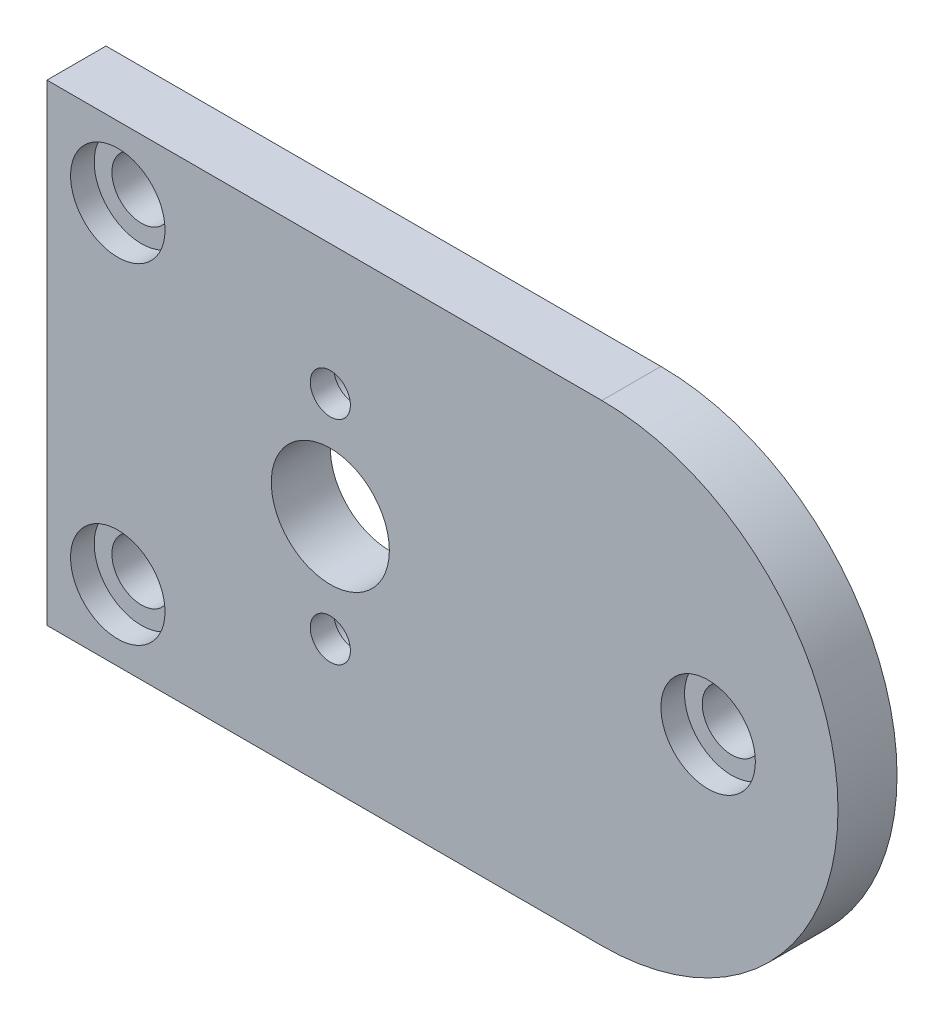
ISO-10303-21;
HEADER;
FILE_DESCRIPTION(('STEP AP214'),'2;1');
FILE_NAME('part.step','',(''),(''),'','','');
FILE_SCHEMA(('AUTOMOTIVE_DESIGN { 1 0 10303 214 1 1 1 1 }'));
ENDSEC;
DATA;
#1=APPLICATION_CONTEXT('core data for automotive mechanical design processes');
#2=APPLICATION_PROTOCOL_DEFINITION('international standard','automotive_design',2000,#1);
#3=PRODUCT_CONTEXT('',#1,'mechanical');
#4=PRODUCT('Part','Part','',(#3));
#5=PRODUCT_RELATED_PRODUCT_CATEGORY('part','',(#4));
#6=PRODUCT_DEFINITION_FORMATION('','',#4);
#7=PRODUCT_DEFINITION_CONTEXT('part definition',#1,'design');
#8=PRODUCT_DEFINITION('design','',#6,#7);
#9=PRODUCT_DEFINITION_SHAPE('','',#8);
#10=(LENGTH_UNIT() NAMED_UNIT(*) SI_UNIT(.MILLI.,.METRE.));
#11=(NAMED_UNIT(*) PLANE_ANGLE_UNIT() SI_UNIT($,.RADIAN.));
#12=(NAMED_UNIT(*) SI_UNIT($,.STERADIAN.) SOLID_ANGLE_UNIT());
#13=UNCERTAINTY_MEASURE_WITH_UNIT(LENGTH_MEASURE(1.E-05),#10,'distance_accuracy_value','');
#14=(GEOMETRIC_REPRESENTATION_CONTEXT(3) GLOBAL_UNCERTAINTY_ASSIGNED_CONTEXT((#13)) GLOBAL_UNIT_ASSIGNED_CONTEXT((#10,
#11,#12)) REPRESENTATION_CONTEXT('',''));
#15=CARTESIAN_POINT('',(0.,0.,0.));
#16=DIRECTION('',(0.,0.,1.));
#17=DIRECTION('',(1.,0.,0.));
#18=AXIS2_PLACEMENT_3D('',#15,#16,#17);
#19=CARTESIAN_POINT('',(0.,4.5,21.25));
#20=DIRECTION('',(0.,0.,1.));
#21=DIRECTION('',(-1.,0.,0.));
#22=AXIS2_PLACEMENT_3D('',#19,#20,#21);
#23=CYLINDRICAL_SURFACE('',#22,0.85);
#24=CARTESIAN_POINT('',(0.,4.5,23.75));
#25=DIRECTION('',(0.,0.,1.));
#26=DIRECTION('',(1.,0.,0.));
#27=AXIS2_PLACEMENT_3D('',#24,#25,#26);
#28=CIRCLE('',#27,0.85);
#29=CARTESIAN_POINT('',(0.849999999999998,4.5,23.75));
#30=VERTEX_POINT('',#29);
#31=EDGE_CURVE('E167',#30,#30,#28,.T.);
#32=ORIENTED_EDGE('',*,*,#31,.T.);
#33=EDGE_LOOP('',(#32));
#34=FACE_BOUND('',#33,.T.);
#35=CARTESIAN_POINT('',(0.,4.5,22.75));
#36=DIRECTION('',(0.,0.,1.));
#37=DIRECTION('',(1.,0.,0.));
#38=AXIS2_PLACEMENT_3D('',#35,#36,#37);
#39=CIRCLE('',#38,0.85);
#40=CARTESIAN_POINT('',(0.849999999999998,4.5,22.75));
#41=VERTEX_POINT('',#40);
#42=EDGE_CURVE('E198',#41,#41,#39,.T.);
#43=ORIENTED_EDGE('',*,*,#42,.F.);
#44=EDGE_LOOP('',(#43));
#45=FACE_BOUND('',#44,.T.);
#46=ADVANCED_FACE('F117',(#34,#45),#23,.F.);
#47=CARTESIAN_POINT('',(0.,-4.5,21.25));
#48=DIRECTION('',(0.,0.,1.));
#49=DIRECTION('',(-1.,0.,0.));
#50=AXIS2_PLACEMENT_3D('',#47,#48,#49);
#51=CYLINDRICAL_SURFACE('',#50,0.85);
#52=CARTESIAN_POINT('',(0.,-4.5,23.75));
#53=DIRECTION('',(0.,0.,1.));
#54=DIRECTION('',(1.,0.,0.));
#55=AXIS2_PLACEMENT_3D('',#52,#53,#54);
#56=CIRCLE('',#55,0.85);
#57=CARTESIAN_POINT('',(0.850000000000001,-4.5,23.75));
#58=VERTEX_POINT('',#57);
#59=EDGE_CURVE('E205',#58,#58,#56,.T.);
#60=ORIENTED_EDGE('',*,*,#59,.T.);
#61=EDGE_LOOP('',(#60));
#62=FACE_BOUND('',#61,.T.);
#63=CARTESIAN_POINT('',(0.,-4.5,22.75));
#64=DIRECTION('',(0.,0.,1.));
#65=DIRECTION('',(1.,0.,0.));
#66=AXIS2_PLACEMENT_3D('',#63,#64,#65);
#67=CIRCLE('',#66,0.85);
#68=CARTESIAN_POINT('',(0.850000000000001,-4.5,22.75));
#69=VERTEX_POINT('',#68);
#70=EDGE_CURVE('E212',#69,#69,#67,.T.);
#71=ORIENTED_EDGE('',*,*,#70,.F.);
#72=EDGE_LOOP('',(#71));
#73=FACE_BOUND('',#72,.T.);
#74=ADVANCED_FACE('F259',(#62,#73),#51,.F.);
#75=CARTESIAN_POINT('',(0.,10.0000000000001,21.25));
#76=DIRECTION('',(0.,-1.,0.));
#77=DIRECTION('',(1.,0.,0.));
#78=AXIS2_PLACEMENT_3D('',#75,#76,#77);
#79=PLANE('',#78);
#80=DIRECTION('',(-1.,0.,0.));
#81=VECTOR('',#80,1.);
#82=CARTESIAN_POINT('',(0.,10.0000000000001,23.75));
#83=LINE('',#82,#81);
#84=CARTESIAN_POINT('',(11.5,10.,23.75));
#85=VERTEX_POINT('',#84);
#86=CARTESIAN_POINT('',(-12.,10.,23.75));
#87=VERTEX_POINT('',#86);
#88=EDGE_CURVE('E164',#85,#87,#83,.T.);
#89=ORIENTED_EDGE('',*,*,#88,.F.);
#90=DIRECTION('',(0.,0.,1.));
#91=VECTOR('',#90,1.);
#92=CARTESIAN_POINT('',(11.5,10.,21.25));
#93=LINE('',#92,#91);
#94=CARTESIAN_POINT('',(11.5,10.,21.25));
#95=VERTEX_POINT('',#94);
#96=EDGE_CURVE('E170',#95,#85,#93,.T.);
#97=ORIENTED_EDGE('',*,*,#96,.F.);
#98=DIRECTION('',(-1.,0.,0.));
#99=VECTOR('',#98,1.);
#100=CARTESIAN_POINT('',(0.,10.0000000000001,21.25));
#101=LINE('',#100,#99);
#102=CARTESIAN_POINT('',(-12.,10.,21.25));
#103=VERTEX_POINT('',#102);
#104=EDGE_CURVE('E188',#95,#103,#101,.T.);
#105=ORIENTED_EDGE('',*,*,#104,.T.);
#106=DIRECTION('',(0.,0.,1.));
#107=VECTOR('',#106,1.);
#108=CARTESIAN_POINT('',(-12.,10.,21.25));
#109=LINE('',#108,#107);
#110=EDGE_CURVE('E13',#103,#87,#109,.T.);
#111=ORIENTED_EDGE('',*,*,#110,.T.);
#112=EDGE_LOOP('',(#89,#97,#105,#111));
#113=FACE_BOUND('',#112,.T.);
#114=ADVANCED_FACE('F178',(#113),#79,.F.);
#115=CARTESIAN_POINT('',(-12.,0.,21.25));
#116=DIRECTION('',(1.,0.,0.));
#117=DIRECTION('',(0.,1.,0.));
#118=AXIS2_PLACEMENT_3D('',#115,#116,#117);
#119=PLANE('',#118);
#120=DIRECTION('',(0.,-1.,0.));
#121=VECTOR('',#120,1.);
#122=CARTESIAN_POINT('',(-12.,0.,23.75));
#123=LINE('',#122,#121);
#124=CARTESIAN_POINT('',(-12.,-10.,23.75));
#125=VERTEX_POINT('',#124);
#126=EDGE_CURVE('E180',#87,#125,#123,.T.);
#127=ORIENTED_EDGE('',*,*,#126,.F.);
#128=ORIENTED_EDGE('',*,*,#110,.F.);
#129=DIRECTION('',(0.,-1.,0.));
#130=VECTOR('',#129,1.);
#131=CARTESIAN_POINT('',(-12.,0.,21.25));
#132=LINE('',#131,#130);
#133=CARTESIAN_POINT('',(-12.,-10.,21.25));
#134=VERTEX_POINT('',#133);
#135=EDGE_CURVE('E240',#103,#134,#132,.T.);
#136=ORIENTED_EDGE('',*,*,#135,.T.);
#137=DIRECTION('',(0.,0.,1.));
#138=VECTOR('',#137,1.);
#139=CARTESIAN_POINT('',(-12.,-10.,21.25));
#140=LINE('',#139,#138);
#141=EDGE_CURVE('E126',#134,#125,#140,.T.);
#142=ORIENTED_EDGE('',*,*,#141,.T.);
#143=EDGE_LOOP('',(#127,#128,#136,#142));
#144=FACE_BOUND('',#143,.T.);
#145=ADVANCED_FACE('F243',(#144),#119,.F.);
#146=CARTESIAN_POINT('',(0.,-10.,21.25));
#147=DIRECTION('',(0.,-1.,0.));
#148=DIRECTION('',(0.,0.,1.));
#149=AXIS2_PLACEMENT_3D('',#146,#147,#148);
#150=PLANE('',#149);
#151=DIRECTION('',(-1.,0.,0.));
#152=VECTOR('',#151,1.);
#153=CARTESIAN_POINT('',(0.,-10.,23.75));
#154=LINE('',#153,#152);
#155=CARTESIAN_POINT('',(11.5,-10.,23.75));
#156=VERTEX_POINT('',#155);
#157=EDGE_CURVE('E165',#156,#125,#154,.T.);
#158=ORIENTED_EDGE('',*,*,#157,.T.);
#159=ORIENTED_EDGE('',*,*,#141,.F.);
#160=DIRECTION('',(-1.,0.,0.));
#161=VECTOR('',#160,1.);
#162=CARTESIAN_POINT('',(0.,-10.,21.25));
#163=LINE('',#162,#161);
#164=CARTESIAN_POINT('',(11.5,-10.,21.25));
#165=VERTEX_POINT('',#164);
#166=EDGE_CURVE('E135',#165,#134,#163,.T.);
#167=ORIENTED_EDGE('',*,*,#166,.F.);
#168=DIRECTION('',(0.,0.,1.));
#169=VECTOR('',#168,1.);
#170=CARTESIAN_POINT('',(11.5,-10.,21.25));
#171=LINE('',#170,#169);
#172=EDGE_CURVE('E175',#165,#156,#171,.T.);
#173=ORIENTED_EDGE('',*,*,#172,.T.);
#174=EDGE_LOOP('',(#158,#159,#167,#173));
#175=FACE_BOUND('',#174,.T.);
#176=ADVANCED_FACE('F247',(#175),#150,.T.);
#177=CARTESIAN_POINT('',(0.,0.,21.25));
#178=DIRECTION('',(0.,0.,-1.));
#179=DIRECTION('',(1.,0.,0.));
#180=AXIS2_PLACEMENT_3D('',#177,#178,#179);
#181=PLANE('',#180);
#182=CARTESIAN_POINT('',(0.,4.5,21.25));
#183=DIRECTION('',(0.,0.,1.));
#184=DIRECTION('',(1.,0.,0.));
#185=AXIS2_PLACEMENT_3D('',#182,#183,#184);
#186=CIRCLE('',#185,1.1);
#187=CARTESIAN_POINT('',(1.1,4.5,21.25));
#188=VERTEX_POINT('',#187);
#189=EDGE_CURVE('E235',#188,#188,#186,.T.);
#190=ORIENTED_EDGE('',*,*,#189,.T.);
#191=EDGE_LOOP('',(#190));
#192=FACE_BOUND('',#191,.T.);
#193=CARTESIAN_POINT('',(0.,-4.5,21.25));
#194=DIRECTION('',(0.,0.,1.));
#195=DIRECTION('',(1.,0.,0.));
#196=AXIS2_PLACEMENT_3D('',#193,#194,#195);
#197=CIRCLE('',#196,1.1);
#198=CARTESIAN_POINT('',(1.1,-4.5,21.25));
#199=VERTEX_POINT('',#198);
#200=EDGE_CURVE('E230',#199,#199,#197,.T.);
#201=ORIENTED_EDGE('',*,*,#200,.T.);
#202=EDGE_LOOP('',(#201));
#203=FACE_BOUND('',#202,.T.);
#204=ORIENTED_EDGE('',*,*,#104,.F.);
#205=CARTESIAN_POINT('',(11.5,0.,21.25));
#206=DIRECTION('',(0.,0.,1.));
#207=DIRECTION('',(1.,0.,0.));
#208=AXIS2_PLACEMENT_3D('',#205,#206,#207);
#209=CIRCLE('',#208,10.);
#210=EDGE_CURVE('E166',#165,#95,#209,.T.);
#211=ORIENTED_EDGE('',*,*,#210,.F.);
#212=ORIENTED_EDGE('',*,*,#166,.T.);
#213=ORIENTED_EDGE('',*,*,#135,.F.);
#214=EDGE_LOOP('',(#204,#211,#212,#213));
#215=FACE_BOUND('',#214,.T.);
#216=CARTESIAN_POINT('',(-9.00000000000001,7.,21.25));
#217=DIRECTION('',(0.,0.,1.));
#218=DIRECTION('',(1.,0.,0.));
#219=AXIS2_PLACEMENT_3D('',#216,#217,#218);
#220=CIRCLE('',#219,1.25);
#221=CARTESIAN_POINT('',(-7.75000000000001,7.,21.25));
#222=VERTEX_POINT('',#221);
#223=EDGE_CURVE('E197',#222,#222,#220,.T.);
#224=ORIENTED_EDGE('',*,*,#223,.T.);
#225=EDGE_LOOP('',(#224));
#226=FACE_BOUND('',#225,.T.);
#227=CARTESIAN_POINT('',(0.,0.,21.25));
#228=DIRECTION('',(0.,0.,1.));
#229=DIRECTION('',(1.,0.,0.));
#230=AXIS2_PLACEMENT_3D('',#227,#228,#229);
#231=CIRCLE('',#230,2.5);
#232=CARTESIAN_POINT('',(2.5,0.,21.25));
#233=VERTEX_POINT('',#232);
#234=EDGE_CURVE('E202',#233,#233,#231,.T.);
#235=ORIENTED_EDGE('',*,*,#234,.T.);
#236=EDGE_LOOP('',(#235));
#237=FACE_BOUND('',#236,.T.);
#238=CARTESIAN_POINT('',(-9.00000000000001,-7.,21.25));
#239=DIRECTION('',(0.,0.,1.));
#240=DIRECTION('',(1.,0.,0.));
#241=AXIS2_PLACEMENT_3D('',#238,#239,#240);
#242=CIRCLE('',#241,1.25);
#243=CARTESIAN_POINT('',(-7.75,-7.,21.25));
#244=VERTEX_POINT('',#243);
#245=EDGE_CURVE('E194',#244,#244,#242,.T.);
#246=ORIENTED_EDGE('',*,*,#245,.T.);
#247=EDGE_LOOP('',(#246));
#248=FACE_BOUND('',#247,.T.);
#249=CARTESIAN_POINT('',(16.,0.,21.25));
#250=DIRECTION('',(0.,0.,1.));
#251=DIRECTION('',(1.,0.,0.));
#252=AXIS2_PLACEMENT_3D('',#249,#250,#251);
#253=CIRCLE('',#252,1.25);
#254=CARTESIAN_POINT('',(17.25,0.,21.25));
#255=VERTEX_POINT('',#254);
#256=EDGE_CURVE('E176',#255,#255,#253,.T.);
#257=ORIENTED_EDGE('',*,*,#256,.T.);
#258=EDGE_LOOP('',(#257));
#259=FACE_BOUND('',#258,.T.);
#260=ADVANCED_FACE('F244',(#192,#203,#215,#226,#237,#248,#259),#181,.T.);
#261=CARTESIAN_POINT('',(0.,0.,23.75));
#262=DIRECTION('',(0.,0.,-1.));
#263=DIRECTION('',(1.,0.,0.));
#264=AXIS2_PLACEMENT_3D('',#261,#262,#263);
#265=PLANE('',#264);
#266=CARTESIAN_POINT('',(16.,0.,23.75));
#267=DIRECTION('',(0.,0.,1.));
#268=DIRECTION('',(1.,0.,0.));
#269=AXIS2_PLACEMENT_3D('',#266,#267,#268);
#270=CIRCLE('',#269,2.);
#271=CARTESIAN_POINT('',(18.,0.,23.75));
#272=VERTEX_POINT('',#271);
#273=EDGE_CURVE('E291',#272,#272,#270,.T.);
#274=ORIENTED_EDGE('',*,*,#273,.F.);
#275=EDGE_LOOP('',(#274));
#276=FACE_BOUND('',#275,.T.);
#277=CARTESIAN_POINT('',(-9.00000000000001,-7.,23.75));
#278=DIRECTION('',(0.,0.,1.));
#279=DIRECTION('',(1.,0.,0.));
#280=AXIS2_PLACEMENT_3D('',#277,#278,#279);
#281=CIRCLE('',#280,2.);
#282=CARTESIAN_POINT('',(-7.00000000000001,-7.,23.75));
#283=VERTEX_POINT('',#282);
#284=EDGE_CURVE('E288',#283,#283,#281,.T.);
#285=ORIENTED_EDGE('',*,*,#284,.F.);
#286=EDGE_LOOP('',(#285));
#287=FACE_BOUND('',#286,.T.);
#288=CARTESIAN_POINT('',(-9.00000000000001,7.,23.75));
#289=DIRECTION('',(0.,0.,1.));
#290=DIRECTION('',(1.,0.,0.));
#291=AXIS2_PLACEMENT_3D('',#288,#289,#290);
#292=CIRCLE('',#291,2.);
#293=CARTESIAN_POINT('',(-7.,7.,23.75));
#294=VERTEX_POINT('',#293);
#295=EDGE_CURVE('E281',#294,#294,#292,.T.);
#296=ORIENTED_EDGE('',*,*,#295,.F.);
#297=EDGE_LOOP('',(#296));
#298=FACE_BOUND('',#297,.T.);
#299=ORIENTED_EDGE('',*,*,#88,.T.);
#300=ORIENTED_EDGE('',*,*,#126,.T.);
#301=ORIENTED_EDGE('',*,*,#157,.F.);
#302=CARTESIAN_POINT('',(11.5,0.,23.75));
#303=DIRECTION('',(0.,0.,1.));
#304=DIRECTION('',(1.,0.,0.));
#305=AXIS2_PLACEMENT_3D('',#302,#303,#304);
#306=CIRCLE('',#305,10.);
#307=EDGE_CURVE('E155',#156,#85,#306,.T.);
#308=ORIENTED_EDGE('',*,*,#307,.T.);
#309=EDGE_LOOP('',(#299,#300,#301,#308));
#310=FACE_BOUND('',#309,.T.);
#311=ORIENTED_EDGE('',*,*,#31,.F.);
#312=EDGE_LOOP('',(#311));
#313=FACE_BOUND('',#312,.T.);
#314=ORIENTED_EDGE('',*,*,#59,.F.);
#315=EDGE_LOOP('',(#314));
#316=FACE_BOUND('',#315,.T.);
#317=CARTESIAN_POINT('',(0.,0.,23.75));
#318=DIRECTION('',(0.,0.,1.));
#319=DIRECTION('',(1.,0.,0.));
#320=AXIS2_PLACEMENT_3D('',#317,#318,#319);
#321=CIRCLE('',#320,2.5);
#322=CARTESIAN_POINT('',(2.5,0.,23.75));
#323=VERTEX_POINT('',#322);
#324=EDGE_CURVE('E201',#323,#323,#321,.T.);
#325=ORIENTED_EDGE('',*,*,#324,.F.);
#326=EDGE_LOOP('',(#325));
#327=FACE_BOUND('',#326,.T.);
#328=ADVANCED_FACE('F160',(#276,#287,#298,#310,#313,#316,#327),#265,.F.);
#329=CARTESIAN_POINT('',(16.,0.,21.25));
#330=DIRECTION('',(0.,0.,1.));
#331=DIRECTION('',(-1.,0.,0.));
#332=AXIS2_PLACEMENT_3D('',#329,#330,#331);
#333=CYLINDRICAL_SURFACE('',#332,1.25);
#334=CARTESIAN_POINT('',(16.,0.,22.75));
#335=DIRECTION('',(0.,0.,1.));
#336=DIRECTION('',(1.,0.,0.));
#337=AXIS2_PLACEMENT_3D('',#334,#335,#336);
#338=CIRCLE('',#337,1.25);
#339=CARTESIAN_POINT('',(17.25,0.,22.75));
#340=VERTEX_POINT('',#339);
#341=EDGE_CURVE('E120',#340,#340,#338,.T.);
#342=ORIENTED_EDGE('',*,*,#341,.T.);
#343=EDGE_LOOP('',(#342));
#344=FACE_BOUND('',#343,.T.);
#345=ORIENTED_EDGE('',*,*,#256,.F.);
#346=EDGE_LOOP('',(#345));
#347=FACE_BOUND('',#346,.T.);
#348=ADVANCED_FACE('F304',(#344,#347),#333,.F.);
#349=CARTESIAN_POINT('',(-9.00000000000001,-7.,21.25));
#350=DIRECTION('',(0.,0.,1.));
#351=DIRECTION('',(-1.,0.,0.));
#352=AXIS2_PLACEMENT_3D('',#349,#350,#351);
#353=CYLINDRICAL_SURFACE('',#352,1.25);
#354=CARTESIAN_POINT('',(-9.00000000000001,-7.,22.75));
#355=DIRECTION('',(0.,0.,1.));
#356=DIRECTION('',(1.,0.,0.));
#357=AXIS2_PLACEMENT_3D('',#354,#355,#356);
#358=CIRCLE('',#357,1.25);
#359=CARTESIAN_POINT('',(-7.75,-7.,22.75));
#360=VERTEX_POINT('',#359);
#361=EDGE_CURVE('E220',#360,#360,#358,.T.);
#362=ORIENTED_EDGE('',*,*,#361,.T.);
#363=EDGE_LOOP('',(#362));
#364=FACE_BOUND('',#363,.T.);
#365=ORIENTED_EDGE('',*,*,#245,.F.);
#366=EDGE_LOOP('',(#365));
#367=FACE_BOUND('',#366,.T.);
#368=ADVANCED_FACE('F449',(#364,#367),#353,.F.);
#369=CARTESIAN_POINT('',(0.,0.,21.25));
#370=DIRECTION('',(0.,0.,1.));
#371=DIRECTION('',(-1.,0.,0.));
#372=AXIS2_PLACEMENT_3D('',#369,#370,#371);
#373=CYLINDRICAL_SURFACE('',#372,2.5);
#374=ORIENTED_EDGE('',*,*,#234,.F.);
#375=EDGE_LOOP('',(#374));
#376=FACE_BOUND('',#375,.T.);
#377=ORIENTED_EDGE('',*,*,#324,.T.);
#378=EDGE_LOOP('',(#377));
#379=FACE_BOUND('',#378,.T.);
#380=ADVANCED_FACE('F440',(#376,#379),#373,.F.);
#381=CARTESIAN_POINT('',(-9.00000000000001,7.,21.25));
#382=DIRECTION('',(0.,0.,1.));
#383=DIRECTION('',(-1.,0.,0.));
#384=AXIS2_PLACEMENT_3D('',#381,#382,#383);
#385=CYLINDRICAL_SURFACE('',#384,1.25);
#386=CARTESIAN_POINT('',(-9.00000000000001,7.,22.75));
#387=DIRECTION('',(0.,0.,1.));
#388=DIRECTION('',(1.,0.,0.));
#389=AXIS2_PLACEMENT_3D('',#386,#387,#388);
#390=CIRCLE('',#389,1.25);
#391=CARTESIAN_POINT('',(-7.75000000000001,7.,22.75));
#392=VERTEX_POINT('',#391);
#393=EDGE_CURVE('E218',#392,#392,#390,.T.);
#394=ORIENTED_EDGE('',*,*,#393,.T.);
#395=EDGE_LOOP('',(#394));
#396=FACE_BOUND('',#395,.T.);
#397=ORIENTED_EDGE('',*,*,#223,.F.);
#398=EDGE_LOOP('',(#397));
#399=FACE_BOUND('',#398,.T.);
#400=ADVANCED_FACE('F430',(#396,#399),#385,.F.);
#401=CARTESIAN_POINT('',(11.5,0.,21.25));
#402=DIRECTION('',(0.,0.,1.));
#403=DIRECTION('',(-1.,0.,0.));
#404=AXIS2_PLACEMENT_3D('',#401,#402,#403);
#405=CYLINDRICAL_SURFACE('',#404,10.);
#406=ORIENTED_EDGE('',*,*,#307,.F.);
#407=ORIENTED_EDGE('',*,*,#172,.F.);
#408=ORIENTED_EDGE('',*,*,#210,.T.);
#409=ORIENTED_EDGE('',*,*,#96,.T.);
#410=EDGE_LOOP('',(#406,#407,#408,#409));
#411=FACE_BOUND('',#410,.T.);
#412=ADVANCED_FACE('F171',(#411),#405,.T.);
#413=CARTESIAN_POINT('',(0.,-4.5,26.8612698372208));
#414=DIRECTION('',(0.,0.,-1.));
#415=DIRECTION('',(1.,0.,0.));
#416=AXIS2_PLACEMENT_3D('',#413,#414,#415);
#417=CYLINDRICAL_SURFACE('',#416,1.1);
#418=CARTESIAN_POINT('',(0.,-4.5,22.75));
#419=DIRECTION('',(0.,0.,1.));
#420=DIRECTION('',(1.,0.,0.));
#421=AXIS2_PLACEMENT_3D('',#418,#419,#420);
#422=CIRCLE('',#421,1.1);
#423=CARTESIAN_POINT('',(1.1,-4.5,22.75));
#424=VERTEX_POINT('',#423);
#425=EDGE_CURVE('E226',#424,#424,#422,.F.);
#426=ORIENTED_EDGE('',*,*,#425,.F.);
#427=EDGE_LOOP('',(#426));
#428=FACE_BOUND('',#427,.T.);
#429=ORIENTED_EDGE('',*,*,#200,.F.);
#430=EDGE_LOOP('',(#429));
#431=FACE_BOUND('',#430,.T.);
#432=ADVANCED_FACE('F331',(#428,#431),#417,.F.);
#433=CARTESIAN_POINT('',(0.,0.,22.75));
#434=DIRECTION('',(0.,0.,-1.));
#435=DIRECTION('',(1.,0.,0.));
#436=AXIS2_PLACEMENT_3D('',#433,#434,#435);
#437=PLANE('',#436);
#438=ORIENTED_EDGE('',*,*,#70,.T.);
#439=EDGE_LOOP('',(#438));
#440=FACE_BOUND('',#439,.T.);
#441=ORIENTED_EDGE('',*,*,#425,.T.);
#442=EDGE_LOOP('',(#441));
#443=FACE_BOUND('',#442,.T.);
#444=ADVANCED_FACE('F330',(#440,#443),#437,.T.);
#445=CARTESIAN_POINT('',(0.,4.5,26.8612698372208));
#446=DIRECTION('',(0.,0.,-1.));
#447=DIRECTION('',(1.,0.,0.));
#448=AXIS2_PLACEMENT_3D('',#445,#446,#447);
#449=CYLINDRICAL_SURFACE('',#448,1.1);
#450=CARTESIAN_POINT('',(0.,4.5,22.75));
#451=DIRECTION('',(0.,0.,1.));
#452=DIRECTION('',(1.,0.,0.));
#453=AXIS2_PLACEMENT_3D('',#450,#451,#452);
#454=CIRCLE('',#453,1.1);
#455=CARTESIAN_POINT('',(1.1,4.5,22.75));
#456=VERTEX_POINT('',#455);
#457=EDGE_CURVE('E215',#456,#456,#454,.F.);
#458=ORIENTED_EDGE('',*,*,#457,.F.);
#459=EDGE_LOOP('',(#458));
#460=FACE_BOUND('',#459,.T.);
#461=ORIENTED_EDGE('',*,*,#189,.F.);
#462=EDGE_LOOP('',(#461));
#463=FACE_BOUND('',#462,.T.);
#464=ADVANCED_FACE('F273',(#460,#463),#449,.F.);
#465=CARTESIAN_POINT('',(0.,0.,22.75));
#466=DIRECTION('',(0.,0.,-1.));
#467=DIRECTION('',(1.,0.,0.));
#468=AXIS2_PLACEMENT_3D('',#465,#466,#467);
#469=PLANE('',#468);
#470=ORIENTED_EDGE('',*,*,#42,.T.);
#471=EDGE_LOOP('',(#470));
#472=FACE_BOUND('',#471,.T.);
#473=ORIENTED_EDGE('',*,*,#457,.T.);
#474=EDGE_LOOP('',(#473));
#475=FACE_BOUND('',#474,.T.);
#476=ADVANCED_FACE('F269',(#472,#475),#469,.T.);
#477=CARTESIAN_POINT('',(-9.00000000000001,7.,15.5931457505076));
#478=DIRECTION('',(0.,0.,1.));
#479=DIRECTION('',(-1.,0.,0.));
#480=AXIS2_PLACEMENT_3D('',#477,#478,#479);
#481=CYLINDRICAL_SURFACE('',#480,2.);
#482=ORIENTED_EDGE('',*,*,#295,.T.);
#483=EDGE_LOOP('',(#482));
#484=FACE_BOUND('',#483,.T.);
#485=CARTESIAN_POINT('',(-9.00000000000001,7.,22.75));
#486=DIRECTION('',(0.,0.,1.));
#487=DIRECTION('',(1.,0.,0.));
#488=AXIS2_PLACEMENT_3D('',#485,#486,#487);
#489=CIRCLE('',#488,2.);
#490=CARTESIAN_POINT('',(-7.,7.,22.75));
#491=VERTEX_POINT('',#490);
#492=EDGE_CURVE('E285',#491,#491,#489,.T.);
#493=ORIENTED_EDGE('',*,*,#492,.F.);
#494=EDGE_LOOP('',(#493));
#495=FACE_BOUND('',#494,.T.);
#496=ADVANCED_FACE('F272',(#484,#495),#481,.F.);
#497=CARTESIAN_POINT('',(0.,0.,22.75));
#498=DIRECTION('',(0.,0.,-1.));
#499=DIRECTION('',(1.,0.,0.));
#500=AXIS2_PLACEMENT_3D('',#497,#498,#499);
#501=PLANE('',#500);
#502=ORIENTED_EDGE('',*,*,#393,.F.);
#503=EDGE_LOOP('',(#502));
#504=FACE_BOUND('',#503,.T.);
#505=ORIENTED_EDGE('',*,*,#492,.T.);
#506=EDGE_LOOP('',(#505));
#507=FACE_BOUND('',#506,.T.);
#508=ADVANCED_FACE('F311',(#504,#507),#501,.F.);
#509=CARTESIAN_POINT('',(-9.00000000000001,-7.,15.5931457505076));
#510=DIRECTION('',(0.,0.,1.));
#511=DIRECTION('',(-1.,0.,0.));
#512=AXIS2_PLACEMENT_3D('',#509,#510,#511);
#513=CYLINDRICAL_SURFACE('',#512,2.);
#514=ORIENTED_EDGE('',*,*,#284,.T.);
#515=EDGE_LOOP('',(#514));
#516=FACE_BOUND('',#515,.T.);
#517=CARTESIAN_POINT('',(-9.00000000000001,-7.,22.75));
#518=DIRECTION('',(0.,0.,1.));
#519=DIRECTION('',(1.,0.,0.));
#520=AXIS2_PLACEMENT_3D('',#517,#518,#519);
#521=CIRCLE('',#520,2.);
#522=CARTESIAN_POINT('',(-7.00000000000001,-7.,22.75));
#523=VERTEX_POINT('',#522);
#524=EDGE_CURVE('E284',#523,#523,#521,.T.);
#525=ORIENTED_EDGE('',*,*,#524,.F.);
#526=EDGE_LOOP('',(#525));
#527=FACE_BOUND('',#526,.T.);
#528=ADVANCED_FACE('F316',(#516,#527),#513,.F.);
#529=CARTESIAN_POINT('',(0.,0.,22.75));
#530=DIRECTION('',(0.,0.,-1.));
#531=DIRECTION('',(1.,0.,0.));
#532=AXIS2_PLACEMENT_3D('',#529,#530,#531);
#533=PLANE('',#532);
#534=ORIENTED_EDGE('',*,*,#361,.F.);
#535=EDGE_LOOP('',(#534));
#536=FACE_BOUND('',#535,.T.);
#537=ORIENTED_EDGE('',*,*,#524,.T.);
#538=EDGE_LOOP('',(#537));
#539=FACE_BOUND('',#538,.T.);
#540=ADVANCED_FACE('F322',(#536,#539),#533,.F.);
#541=CARTESIAN_POINT('',(16.,0.,15.5931457505076));
#542=DIRECTION('',(0.,0.,1.));
#543=DIRECTION('',(-1.,0.,0.));
#544=AXIS2_PLACEMENT_3D('',#541,#542,#543);
#545=CYLINDRICAL_SURFACE('',#544,2.);
#546=ORIENTED_EDGE('',*,*,#273,.T.);
#547=EDGE_LOOP('',(#546));
#548=FACE_BOUND('',#547,.T.);
#549=CARTESIAN_POINT('',(16.,0.,22.75));
#550=DIRECTION('',(0.,0.,1.));
#551=DIRECTION('',(1.,0.,0.));
#552=AXIS2_PLACEMENT_3D('',#549,#550,#551);
#553=CIRCLE('',#552,2.);
#554=CARTESIAN_POINT('',(18.,0.,22.75));
#555=VERTEX_POINT('',#554);
#556=EDGE_CURVE('E221',#555,#555,#553,.T.);
#557=ORIENTED_EDGE('',*,*,#556,.F.);
#558=EDGE_LOOP('',(#557));
#559=FACE_BOUND('',#558,.T.);
#560=ADVANCED_FACE('F299',(#548,#559),#545,.F.);
#561=CARTESIAN_POINT('',(0.,0.,22.75));
#562=DIRECTION('',(0.,0.,-1.));
#563=DIRECTION('',(1.,0.,0.));
#564=AXIS2_PLACEMENT_3D('',#561,#562,#563);
#565=PLANE('',#564);
#566=ORIENTED_EDGE('',*,*,#341,.F.);
#567=EDGE_LOOP('',(#566));
#568=FACE_BOUND('',#567,.T.);
#569=ORIENTED_EDGE('',*,*,#556,.T.);
#570=EDGE_LOOP('',(#569));
#571=FACE_BOUND('',#570,.T.);
#572=ADVANCED_FACE('F392',(#568,#571),#565,.F.);
#573=CLOSED_SHELL('',(#46,#74,#114,#145,#176,#260,#328,#348,#368,#380,#400,#412,#432,#444,#464,
#476,#496,#508,#528,#540,#560,#572));
#574=MANIFOLD_SOLID_BREP('B2',#573);
#575=ADVANCED_BREP_SHAPE_REPRESENTATION('',(#18,#574),#14);
#576=SHAPE_DEFINITION_REPRESENTATION(#9,#575);
ENDSEC;
END-ISO-10303-21;
